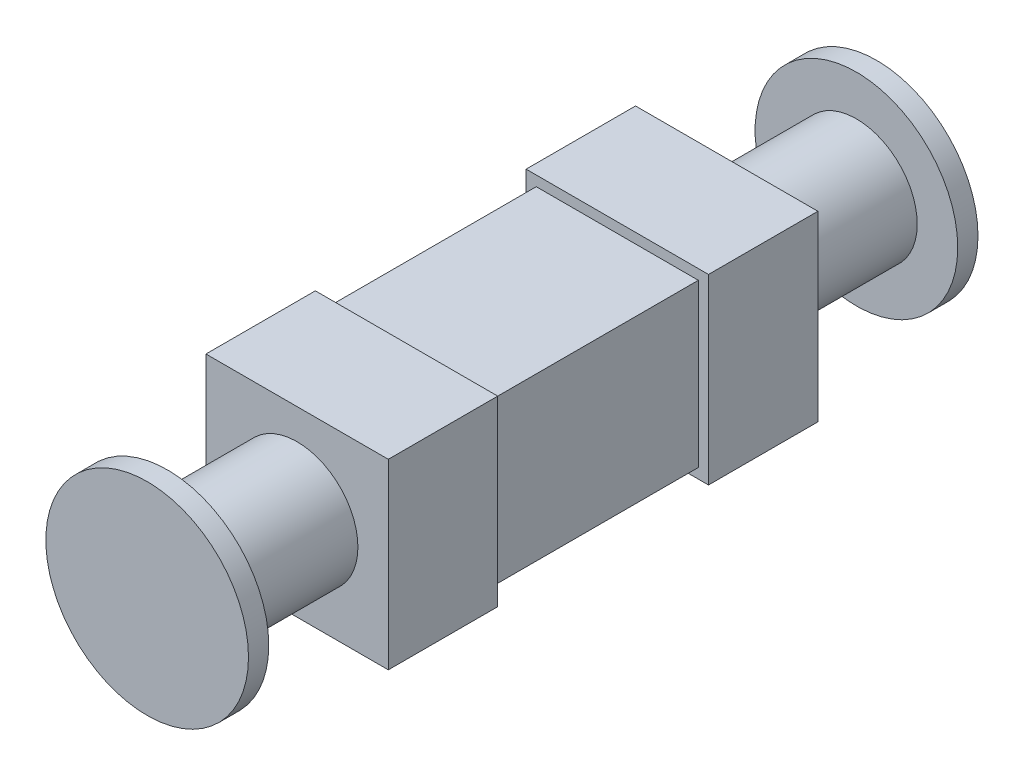
ISO-10303-21;
HEADER;
FILE_DESCRIPTION(('STEP AP214'),'2;1');
FILE_NAME('part.step','',(''),(''),'','','');
FILE_SCHEMA(('AUTOMOTIVE_DESIGN { 1 0 10303 214 1 1 1 1 }'));
ENDSEC;
DATA;
#1=APPLICATION_CONTEXT('core data for automotive mechanical design processes');
#2=APPLICATION_PROTOCOL_DEFINITION('international standard','automotive_design',2000,#1);
#3=PRODUCT_CONTEXT('',#1,'mechanical');
#4=PRODUCT('Part','Part','',(#3));
#5=PRODUCT_RELATED_PRODUCT_CATEGORY('part','',(#4));
#6=PRODUCT_DEFINITION_FORMATION('','',#4);
#7=PRODUCT_DEFINITION_CONTEXT('part definition',#1,'design');
#8=PRODUCT_DEFINITION('design','',#6,#7);
#9=PRODUCT_DEFINITION_SHAPE('','',#8);
#10=(LENGTH_UNIT() NAMED_UNIT(*) SI_UNIT(.MILLI.,.METRE.));
#11=(NAMED_UNIT(*) PLANE_ANGLE_UNIT() SI_UNIT($,.RADIAN.));
#12=(NAMED_UNIT(*) SI_UNIT($,.STERADIAN.) SOLID_ANGLE_UNIT());
#13=UNCERTAINTY_MEASURE_WITH_UNIT(LENGTH_MEASURE(1.E-05),#10,'distance_accuracy_value','');
#14=(GEOMETRIC_REPRESENTATION_CONTEXT(3) GLOBAL_UNCERTAINTY_ASSIGNED_CONTEXT((#13)) GLOBAL_UNIT_ASSIGNED_CONTEXT((#10,
#11,#12)) REPRESENTATION_CONTEXT('',''));
#15=CARTESIAN_POINT('',(0.,0.,0.));
#16=DIRECTION('',(0.,0.,1.));
#17=DIRECTION('',(1.,0.,0.));
#18=AXIS2_PLACEMENT_3D('',#15,#16,#17);
#19=CARTESIAN_POINT('',(-2.,-2.,-10.9568542494924));
#20=DIRECTION('',(-1.,0.,0.));
#21=DIRECTION('',(0.,0.,1.));
#22=AXIS2_PLACEMENT_3D('',#19,#20,#21);
#23=PLANE('',#22);
#24=DIRECTION('',(0.,0.,1.));
#25=VECTOR('',#24,1.);
#26=CARTESIAN_POINT('',(-2.,2.,-10.9568542494924));
#27=LINE('',#26,#25);
#28=CARTESIAN_POINT('',(-2.,2.,-2.6));
#29=VERTEX_POINT('',#28);
#30=CARTESIAN_POINT('',(-2.,2.,2.6));
#31=VERTEX_POINT('',#30);
#32=EDGE_CURVE('E215',#29,#31,#27,.T.);
#33=ORIENTED_EDGE('',*,*,#32,.F.);
#34=DIRECTION('',(0.,-1.,0.));
#35=VECTOR('',#34,1.);
#36=CARTESIAN_POINT('',(-2.,-2.,-2.6));
#37=LINE('',#36,#35);
#38=CARTESIAN_POINT('',(-2.,-2.,-2.6));
#39=VERTEX_POINT('',#38);
#40=EDGE_CURVE('E173',#29,#39,#37,.T.);
#41=ORIENTED_EDGE('',*,*,#40,.T.);
#42=DIRECTION('',(0.,0.,1.));
#43=VECTOR('',#42,1.);
#44=CARTESIAN_POINT('',(-2.,-2.,-10.9568542494924));
#45=LINE('',#44,#43);
#46=CARTESIAN_POINT('',(-2.,-2.,2.6));
#47=VERTEX_POINT('',#46);
#48=EDGE_CURVE('E59',#39,#47,#45,.T.);
#49=ORIENTED_EDGE('',*,*,#48,.T.);
#50=DIRECTION('',(0.,1.,0.));
#51=VECTOR('',#50,1.);
#52=CARTESIAN_POINT('',(-2.,-2.,2.6));
#53=LINE('',#52,#51);
#54=EDGE_CURVE('E213',#47,#31,#53,.T.);
#55=ORIENTED_EDGE('',*,*,#54,.T.);
#56=EDGE_LOOP('',(#33,#41,#49,#55));
#57=FACE_BOUND('',#56,.T.);
#58=ADVANCED_FACE('F37',(#57),#23,.T.);
#59=CARTESIAN_POINT('',(2.,2.,-10.9568542494924));
#60=DIRECTION('',(0.,1.,0.));
#61=DIRECTION('',(-1.,0.,0.));
#62=AXIS2_PLACEMENT_3D('',#59,#60,#61);
#63=PLANE('',#62);
#64=DIRECTION('',(0.,0.,1.));
#65=VECTOR('',#64,1.);
#66=CARTESIAN_POINT('',(2.,2.,-10.9568542494924));
#67=LINE('',#66,#65);
#68=CARTESIAN_POINT('',(2.,2.,-2.6));
#69=VERTEX_POINT('',#68);
#70=CARTESIAN_POINT('',(2.,2.,2.6));
#71=VERTEX_POINT('',#70);
#72=EDGE_CURVE('E218',#69,#71,#67,.T.);
#73=ORIENTED_EDGE('',*,*,#72,.F.);
#74=DIRECTION('',(-1.,0.,0.));
#75=VECTOR('',#74,1.);
#76=CARTESIAN_POINT('',(2.,2.,-2.6));
#77=LINE('',#76,#75);
#78=EDGE_CURVE('E170',#69,#29,#77,.T.);
#79=ORIENTED_EDGE('',*,*,#78,.T.);
#80=ORIENTED_EDGE('',*,*,#32,.T.);
#81=DIRECTION('',(1.,0.,0.));
#82=VECTOR('',#81,1.);
#83=CARTESIAN_POINT('',(2.,2.,2.6));
#84=LINE('',#83,#82);
#85=EDGE_CURVE('E210',#31,#71,#84,.T.);
#86=ORIENTED_EDGE('',*,*,#85,.T.);
#87=EDGE_LOOP('',(#73,#79,#80,#86));
#88=FACE_BOUND('',#87,.T.);
#89=ADVANCED_FACE('F259',(#88),#63,.T.);
#90=CARTESIAN_POINT('',(2.,-2.,-10.9568542494924));
#91=DIRECTION('',(1.,0.,0.));
#92=DIRECTION('',(0.,0.,-1.));
#93=AXIS2_PLACEMENT_3D('',#90,#91,#92);
#94=PLANE('',#93);
#95=DIRECTION('',(0.,0.,1.));
#96=VECTOR('',#95,1.);
#97=CARTESIAN_POINT('',(2.,-2.,-10.9568542494924));
#98=LINE('',#97,#96);
#99=CARTESIAN_POINT('',(2.,-2.,-2.6));
#100=VERTEX_POINT('',#99);
#101=CARTESIAN_POINT('',(2.,-2.,2.6));
#102=VERTEX_POINT('',#101);
#103=EDGE_CURVE('E220',#100,#102,#98,.T.);
#104=ORIENTED_EDGE('',*,*,#103,.F.);
#105=DIRECTION('',(0.,1.,0.));
#106=VECTOR('',#105,1.);
#107=CARTESIAN_POINT('',(2.,-2.,-2.6));
#108=LINE('',#107,#106);
#109=EDGE_CURVE('E52',#100,#69,#108,.T.);
#110=ORIENTED_EDGE('',*,*,#109,.T.);
#111=ORIENTED_EDGE('',*,*,#72,.T.);
#112=DIRECTION('',(0.,-1.,0.));
#113=VECTOR('',#112,1.);
#114=CARTESIAN_POINT('',(2.,-2.,2.6));
#115=LINE('',#114,#113);
#116=EDGE_CURVE('E202',#71,#102,#115,.T.);
#117=ORIENTED_EDGE('',*,*,#116,.T.);
#118=EDGE_LOOP('',(#104,#110,#111,#117));
#119=FACE_BOUND('',#118,.T.);
#120=ADVANCED_FACE('F256',(#119),#94,.T.);
#121=CARTESIAN_POINT('',(2.,-2.,-10.9568542494924));
#122=DIRECTION('',(0.,-1.,0.));
#123=DIRECTION('',(0.,0.,-1.));
#124=AXIS2_PLACEMENT_3D('',#121,#122,#123);
#125=PLANE('',#124);
#126=ORIENTED_EDGE('',*,*,#48,.F.);
#127=DIRECTION('',(1.,0.,0.));
#128=VECTOR('',#127,1.);
#129=CARTESIAN_POINT('',(2.,-2.,-2.6));
#130=LINE('',#129,#128);
#131=EDGE_CURVE('E11',#39,#100,#130,.T.);
#132=ORIENTED_EDGE('',*,*,#131,.T.);
#133=ORIENTED_EDGE('',*,*,#103,.T.);
#134=DIRECTION('',(-1.,0.,0.));
#135=VECTOR('',#134,1.);
#136=CARTESIAN_POINT('',(2.,-2.,2.6));
#137=LINE('',#136,#135);
#138=EDGE_CURVE('E45',#102,#47,#137,.T.);
#139=ORIENTED_EDGE('',*,*,#138,.T.);
#140=EDGE_LOOP('',(#126,#132,#133,#139));
#141=FACE_BOUND('',#140,.T.);
#142=ADVANCED_FACE('F248',(#141),#125,.T.);
#143=CARTESIAN_POINT('',(-2.25,-2.25,2.6));
#144=DIRECTION('',(-1.,0.,0.));
#145=DIRECTION('',(0.,0.,1.));
#146=AXIS2_PLACEMENT_3D('',#143,#144,#145);
#147=PLANE('',#146);
#148=DIRECTION('',(0.,-1.,0.));
#149=VECTOR('',#148,1.);
#150=CARTESIAN_POINT('',(-2.25,-2.25,5.3));
#151=LINE('',#150,#149);
#152=CARTESIAN_POINT('',(-2.25,2.25,5.3));
#153=VERTEX_POINT('',#152);
#154=CARTESIAN_POINT('',(-2.25,-2.25,5.3));
#155=VERTEX_POINT('',#154);
#156=EDGE_CURVE('E175',#153,#155,#151,.T.);
#157=ORIENTED_EDGE('',*,*,#156,.F.);
#158=DIRECTION('',(0.,0.,1.));
#159=VECTOR('',#158,1.);
#160=CARTESIAN_POINT('',(-2.25,2.25,2.6));
#161=LINE('',#160,#159);
#162=CARTESIAN_POINT('',(-2.25,2.25,2.6));
#163=VERTEX_POINT('',#162);
#164=EDGE_CURVE('E200',#163,#153,#161,.T.);
#165=ORIENTED_EDGE('',*,*,#164,.F.);
#166=DIRECTION('',(0.,-1.,0.));
#167=VECTOR('',#166,1.);
#168=CARTESIAN_POINT('',(-2.25,-2.25,2.6));
#169=LINE('',#168,#167);
#170=CARTESIAN_POINT('',(-2.25,-2.25,2.6));
#171=VERTEX_POINT('',#170);
#172=EDGE_CURVE('E176',#163,#171,#169,.T.);
#173=ORIENTED_EDGE('',*,*,#172,.T.);
#174=DIRECTION('',(0.,0.,1.));
#175=VECTOR('',#174,1.);
#176=CARTESIAN_POINT('',(-2.25,-2.25,2.6));
#177=LINE('',#176,#175);
#178=EDGE_CURVE('E189',#171,#155,#177,.T.);
#179=ORIENTED_EDGE('',*,*,#178,.T.);
#180=EDGE_LOOP('',(#157,#165,#173,#179));
#181=FACE_BOUND('',#180,.T.);
#182=ADVANCED_FACE('F329',(#181),#147,.T.);
#183=CARTESIAN_POINT('',(2.25,2.25,2.6));
#184=DIRECTION('',(0.,1.,0.));
#185=DIRECTION('',(-1.,0.,0.));
#186=AXIS2_PLACEMENT_3D('',#183,#184,#185);
#187=PLANE('',#186);
#188=DIRECTION('',(-1.,0.,0.));
#189=VECTOR('',#188,1.);
#190=CARTESIAN_POINT('',(2.25,2.25,5.3));
#191=LINE('',#190,#189);
#192=CARTESIAN_POINT('',(2.25,2.25,5.3));
#193=VERTEX_POINT('',#192);
#194=EDGE_CURVE('E180',#193,#153,#191,.T.);
#195=ORIENTED_EDGE('',*,*,#194,.F.);
#196=DIRECTION('',(0.,0.,1.));
#197=VECTOR('',#196,1.);
#198=CARTESIAN_POINT('',(2.25,2.25,2.6));
#199=LINE('',#198,#197);
#200=CARTESIAN_POINT('',(2.25,2.25,2.6));
#201=VERTEX_POINT('',#200);
#202=EDGE_CURVE('E203',#201,#193,#199,.T.);
#203=ORIENTED_EDGE('',*,*,#202,.F.);
#204=DIRECTION('',(-1.,0.,0.));
#205=VECTOR('',#204,1.);
#206=CARTESIAN_POINT('',(2.25,2.25,2.6));
#207=LINE('',#206,#205);
#208=EDGE_CURVE('E186',#201,#163,#207,.T.);
#209=ORIENTED_EDGE('',*,*,#208,.T.);
#210=ORIENTED_EDGE('',*,*,#164,.T.);
#211=EDGE_LOOP('',(#195,#203,#209,#210));
#212=FACE_BOUND('',#211,.T.);
#213=ADVANCED_FACE('F339',(#212),#187,.T.);
#214=CARTESIAN_POINT('',(2.25,-2.25,2.6));
#215=DIRECTION('',(1.,0.,0.));
#216=DIRECTION('',(0.,0.,-1.));
#217=AXIS2_PLACEMENT_3D('',#214,#215,#216);
#218=PLANE('',#217);
#219=DIRECTION('',(0.,1.,0.));
#220=VECTOR('',#219,1.);
#221=CARTESIAN_POINT('',(2.25,-2.25,5.3));
#222=LINE('',#221,#220);
#223=CARTESIAN_POINT('',(2.25,-2.25,5.3));
#224=VERTEX_POINT('',#223);
#225=EDGE_CURVE('E195',#224,#193,#222,.T.);
#226=ORIENTED_EDGE('',*,*,#225,.F.);
#227=DIRECTION('',(0.,0.,1.));
#228=VECTOR('',#227,1.);
#229=CARTESIAN_POINT('',(2.25,-2.25,2.6));
#230=LINE('',#229,#228);
#231=CARTESIAN_POINT('',(2.25,-2.25,2.6));
#232=VERTEX_POINT('',#231);
#233=EDGE_CURVE('E205',#232,#224,#230,.T.);
#234=ORIENTED_EDGE('',*,*,#233,.F.);
#235=DIRECTION('',(0.,1.,0.));
#236=VECTOR('',#235,1.);
#237=CARTESIAN_POINT('',(2.25,-2.25,2.6));
#238=LINE('',#237,#236);
#239=EDGE_CURVE('E183',#232,#201,#238,.T.);
#240=ORIENTED_EDGE('',*,*,#239,.T.);
#241=ORIENTED_EDGE('',*,*,#202,.T.);
#242=EDGE_LOOP('',(#226,#234,#240,#241));
#243=FACE_BOUND('',#242,.T.);
#244=ADVANCED_FACE('F337',(#243),#218,.T.);
#245=CARTESIAN_POINT('',(2.25,-2.25,2.6));
#246=DIRECTION('',(0.,-1.,0.));
#247=DIRECTION('',(1.,0.,0.));
#248=AXIS2_PLACEMENT_3D('',#245,#246,#247);
#249=PLANE('',#248);
#250=DIRECTION('',(1.,0.,0.));
#251=VECTOR('',#250,1.);
#252=CARTESIAN_POINT('',(2.25,-2.25,5.3));
#253=LINE('',#252,#251);
#254=EDGE_CURVE('E192',#155,#224,#253,.T.);
#255=ORIENTED_EDGE('',*,*,#254,.F.);
#256=ORIENTED_EDGE('',*,*,#178,.F.);
#257=DIRECTION('',(1.,0.,0.));
#258=VECTOR('',#257,1.);
#259=CARTESIAN_POINT('',(2.25,-2.25,2.6));
#260=LINE('',#259,#258);
#261=EDGE_CURVE('E179',#171,#232,#260,.T.);
#262=ORIENTED_EDGE('',*,*,#261,.T.);
#263=ORIENTED_EDGE('',*,*,#233,.T.);
#264=EDGE_LOOP('',(#255,#256,#262,#263));
#265=FACE_BOUND('',#264,.T.);
#266=ADVANCED_FACE('F333',(#265),#249,.T.);
#267=CARTESIAN_POINT('',(0.,0.,2.6));
#268=DIRECTION('',(0.,0.,1.));
#269=DIRECTION('',(1.,0.,0.));
#270=AXIS2_PLACEMENT_3D('',#267,#268,#269);
#271=PLANE('',#270);
#272=ORIENTED_EDGE('',*,*,#54,.F.);
#273=ORIENTED_EDGE('',*,*,#138,.F.);
#274=ORIENTED_EDGE('',*,*,#116,.F.);
#275=ORIENTED_EDGE('',*,*,#85,.F.);
#276=EDGE_LOOP('',(#272,#273,#274,#275));
#277=FACE_BOUND('',#276,.T.);
#278=ORIENTED_EDGE('',*,*,#172,.F.);
#279=ORIENTED_EDGE('',*,*,#208,.F.);
#280=ORIENTED_EDGE('',*,*,#239,.F.);
#281=ORIENTED_EDGE('',*,*,#261,.F.);
#282=EDGE_LOOP('',(#278,#279,#280,#281));
#283=FACE_BOUND('',#282,.T.);
#284=ADVANCED_FACE('F252',(#277,#283),#271,.F.);
#285=CARTESIAN_POINT('',(0.,0.,9.));
#286=DIRECTION('',(0.,0.,-1.));
#287=DIRECTION('',(-1.,0.,0.));
#288=AXIS2_PLACEMENT_3D('',#285,#286,#287);
#289=PLANE('',#288);
#290=CARTESIAN_POINT('',(0.,0.,9.));
#291=DIRECTION('',(0.,0.,1.));
#292=DIRECTION('',(1.,0.,0.));
#293=AXIS2_PLACEMENT_3D('',#290,#291,#292);
#294=CIRCLE('',#293,2.5);
#295=CARTESIAN_POINT('',(2.5,0.,9.));
#296=VERTEX_POINT('',#295);
#297=EDGE_CURVE('E243',#296,#296,#294,.T.);
#298=ORIENTED_EDGE('',*,*,#297,.T.);
#299=EDGE_LOOP('',(#298));
#300=FACE_BOUND('',#299,.T.);
#301=ADVANCED_FACE('F39',(#300),#289,.F.);
#302=CARTESIAN_POINT('',(0.,0.,9.));
#303=DIRECTION('',(0.,0.,1.));
#304=DIRECTION('',(1.,0.,0.));
#305=AXIS2_PLACEMENT_3D('',#302,#303,#304);
#306=CYLINDRICAL_SURFACE('',#305,2.5);
#307=ORIENTED_EDGE('',*,*,#297,.F.);
#308=EDGE_LOOP('',(#307));
#309=FACE_BOUND('',#308,.T.);
#310=CARTESIAN_POINT('',(0.,0.,8.5));
#311=DIRECTION('',(0.,0.,1.));
#312=DIRECTION('',(1.,0.,0.));
#313=AXIS2_PLACEMENT_3D('',#310,#311,#312);
#314=CIRCLE('',#313,2.5);
#315=CARTESIAN_POINT('',(2.5,0.,8.5));
#316=VERTEX_POINT('',#315);
#317=EDGE_CURVE('E240',#316,#316,#314,.T.);
#318=ORIENTED_EDGE('',*,*,#317,.T.);
#319=EDGE_LOOP('',(#318));
#320=FACE_BOUND('',#319,.T.);
#321=ADVANCED_FACE('F309',(#309,#320),#306,.T.);
#322=CARTESIAN_POINT('',(0.,2.5,8.5));
#323=DIRECTION('',(0.,0.,1.));
#324=DIRECTION('',(1.,0.,0.));
#325=AXIS2_PLACEMENT_3D('',#322,#323,#324);
#326=PLANE('',#325);
#327=ORIENTED_EDGE('',*,*,#317,.F.);
#328=EDGE_LOOP('',(#327));
#329=FACE_BOUND('',#328,.T.);
#330=CARTESIAN_POINT('',(0.,0.,8.5));
#331=DIRECTION('',(0.,0.,1.));
#332=DIRECTION('',(1.,0.,0.));
#333=AXIS2_PLACEMENT_3D('',#330,#331,#332);
#334=CIRCLE('',#333,1.5);
#335=CARTESIAN_POINT('',(1.5,0.,8.5));
#336=VERTEX_POINT('',#335);
#337=EDGE_CURVE('E237',#336,#336,#334,.T.);
#338=ORIENTED_EDGE('',*,*,#337,.T.);
#339=EDGE_LOOP('',(#338));
#340=FACE_BOUND('',#339,.T.);
#341=ADVANCED_FACE('F306',(#329,#340),#326,.F.);
#342=CARTESIAN_POINT('',(0.,0.,9.));
#343=DIRECTION('',(0.,0.,1.));
#344=DIRECTION('',(1.,0.,0.));
#345=AXIS2_PLACEMENT_3D('',#342,#343,#344);
#346=CYLINDRICAL_SURFACE('',#345,1.5);
#347=ORIENTED_EDGE('',*,*,#337,.F.);
#348=EDGE_LOOP('',(#347));
#349=FACE_BOUND('',#348,.T.);
#350=CARTESIAN_POINT('',(0.,0.,5.3));
#351=DIRECTION('',(0.,0.,1.));
#352=DIRECTION('',(1.,0.,0.));
#353=AXIS2_PLACEMENT_3D('',#350,#351,#352);
#354=CIRCLE('',#353,1.5);
#355=CARTESIAN_POINT('',(1.5,0.,5.3));
#356=VERTEX_POINT('',#355);
#357=EDGE_CURVE('E234',#356,#356,#354,.T.);
#358=ORIENTED_EDGE('',*,*,#357,.T.);
#359=EDGE_LOOP('',(#358));
#360=FACE_BOUND('',#359,.T.);
#361=ADVANCED_FACE('F302',(#349,#360),#346,.T.);
#362=CARTESIAN_POINT('',(0.,1.5,5.3));
#363=DIRECTION('',(0.,0.,-1.));
#364=DIRECTION('',(-1.,0.,0.));
#365=AXIS2_PLACEMENT_3D('',#362,#363,#364);
#366=PLANE('',#365);
#367=ORIENTED_EDGE('',*,*,#357,.F.);
#368=EDGE_LOOP('',(#367));
#369=FACE_BOUND('',#368,.T.);
#370=ORIENTED_EDGE('',*,*,#156,.T.);
#371=ORIENTED_EDGE('',*,*,#254,.T.);
#372=ORIENTED_EDGE('',*,*,#225,.T.);
#373=ORIENTED_EDGE('',*,*,#194,.T.);
#374=EDGE_LOOP('',(#370,#371,#372,#373));
#375=FACE_BOUND('',#374,.T.);
#376=ADVANCED_FACE('F299',(#369,#375),#366,.F.);
#377=CARTESIAN_POINT('',(-2.25,-2.25,-2.6));
#378=DIRECTION('',(1.,0.,0.));
#379=DIRECTION('',(0.,0.,-1.));
#380=AXIS2_PLACEMENT_3D('',#377,#378,#379);
#381=PLANE('',#380);
#382=DIRECTION('',(0.,-1.,0.));
#383=VECTOR('',#382,1.);
#384=CARTESIAN_POINT('',(-2.25,-2.25,-5.3));
#385=LINE('',#384,#383);
#386=CARTESIAN_POINT('',(-2.25,2.25,-5.3));
#387=VERTEX_POINT('',#386);
#388=CARTESIAN_POINT('',(-2.25,-2.25,-5.3));
#389=VERTEX_POINT('',#388);
#390=EDGE_CURVE('E160',#387,#389,#385,.T.);
#391=ORIENTED_EDGE('',*,*,#390,.T.);
#392=DIRECTION('',(0.,0.,-1.));
#393=VECTOR('',#392,1.);
#394=CARTESIAN_POINT('',(-2.25,-2.25,-2.6));
#395=LINE('',#394,#393);
#396=CARTESIAN_POINT('',(-2.25,-2.25,-2.6));
#397=VERTEX_POINT('',#396);
#398=EDGE_CURVE('E152',#397,#389,#395,.T.);
#399=ORIENTED_EDGE('',*,*,#398,.F.);
#400=DIRECTION('',(0.,-1.,0.));
#401=VECTOR('',#400,1.);
#402=CARTESIAN_POINT('',(-2.25,-2.25,-2.6));
#403=LINE('',#402,#401);
#404=CARTESIAN_POINT('',(-2.25,2.25,-2.6));
#405=VERTEX_POINT('',#404);
#406=EDGE_CURVE('E131',#405,#397,#403,.T.);
#407=ORIENTED_EDGE('',*,*,#406,.F.);
#408=DIRECTION('',(0.,0.,-1.));
#409=VECTOR('',#408,1.);
#410=CARTESIAN_POINT('',(-2.25,2.25,-2.6));
#411=LINE('',#410,#409);
#412=EDGE_CURVE('E140',#405,#387,#411,.T.);
#413=ORIENTED_EDGE('',*,*,#412,.T.);
#414=EDGE_LOOP('',(#391,#399,#407,#413));
#415=FACE_BOUND('',#414,.T.);
#416=ADVANCED_FACE('F150',(#415),#381,.F.);
#417=CARTESIAN_POINT('',(2.25,-2.25,-2.6));
#418=DIRECTION('',(0.,1.,0.));
#419=DIRECTION('',(-1.,0.,0.));
#420=AXIS2_PLACEMENT_3D('',#417,#418,#419);
#421=PLANE('',#420);
#422=DIRECTION('',(1.,0.,0.));
#423=VECTOR('',#422,1.);
#424=CARTESIAN_POINT('',(2.25,-2.25,-5.3));
#425=LINE('',#424,#423);
#426=CARTESIAN_POINT('',(2.25,-2.25,-5.3));
#427=VERTEX_POINT('',#426);
#428=EDGE_CURVE('E153',#389,#427,#425,.T.);
#429=ORIENTED_EDGE('',*,*,#428,.T.);
#430=DIRECTION('',(0.,0.,-1.));
#431=VECTOR('',#430,1.);
#432=CARTESIAN_POINT('',(2.25,-2.25,-2.6));
#433=LINE('',#432,#431);
#434=CARTESIAN_POINT('',(2.25,-2.25,-2.6));
#435=VERTEX_POINT('',#434);
#436=EDGE_CURVE('E165',#435,#427,#433,.T.);
#437=ORIENTED_EDGE('',*,*,#436,.F.);
#438=DIRECTION('',(1.,0.,0.));
#439=VECTOR('',#438,1.);
#440=CARTESIAN_POINT('',(2.25,-2.25,-2.6));
#441=LINE('',#440,#439);
#442=EDGE_CURVE('E148',#397,#435,#441,.T.);
#443=ORIENTED_EDGE('',*,*,#442,.F.);
#444=ORIENTED_EDGE('',*,*,#398,.T.);
#445=EDGE_LOOP('',(#429,#437,#443,#444));
#446=FACE_BOUND('',#445,.T.);
#447=ADVANCED_FACE('F369',(#446),#421,.F.);
#448=CARTESIAN_POINT('',(2.25,-2.25,-2.6));
#449=DIRECTION('',(-1.,0.,0.));
#450=DIRECTION('',(0.,0.,1.));
#451=AXIS2_PLACEMENT_3D('',#448,#449,#450);
#452=PLANE('',#451);
#453=DIRECTION('',(0.,1.,0.));
#454=VECTOR('',#453,1.);
#455=CARTESIAN_POINT('',(2.25,-2.25,-5.3));
#456=LINE('',#455,#454);
#457=CARTESIAN_POINT('',(2.25,2.25,-5.3));
#458=VERTEX_POINT('',#457);
#459=EDGE_CURVE('E155',#427,#458,#456,.T.);
#460=ORIENTED_EDGE('',*,*,#459,.T.);
#461=DIRECTION('',(0.,0.,-1.));
#462=VECTOR('',#461,1.);
#463=CARTESIAN_POINT('',(2.25,2.25,-2.6));
#464=LINE('',#463,#462);
#465=CARTESIAN_POINT('',(2.25,2.25,-2.6));
#466=VERTEX_POINT('',#465);
#467=EDGE_CURVE('E147',#466,#458,#464,.T.);
#468=ORIENTED_EDGE('',*,*,#467,.F.);
#469=DIRECTION('',(0.,1.,0.));
#470=VECTOR('',#469,1.);
#471=CARTESIAN_POINT('',(2.25,-2.25,-2.6));
#472=LINE('',#471,#470);
#473=EDGE_CURVE('E134',#435,#466,#472,.T.);
#474=ORIENTED_EDGE('',*,*,#473,.F.);
#475=ORIENTED_EDGE('',*,*,#436,.T.);
#476=EDGE_LOOP('',(#460,#468,#474,#475));
#477=FACE_BOUND('',#476,.T.);
#478=ADVANCED_FACE('F272',(#477),#452,.F.);
#479=CARTESIAN_POINT('',(2.25,2.25,-2.6));
#480=DIRECTION('',(0.,-1.,0.));
#481=DIRECTION('',(1.,0.,0.));
#482=AXIS2_PLACEMENT_3D('',#479,#480,#481);
#483=PLANE('',#482);
#484=DIRECTION('',(-1.,0.,0.));
#485=VECTOR('',#484,1.);
#486=CARTESIAN_POINT('',(2.25,2.25,-5.3));
#487=LINE('',#486,#485);
#488=EDGE_CURVE('E143',#458,#387,#487,.T.);
#489=ORIENTED_EDGE('',*,*,#488,.T.);
#490=ORIENTED_EDGE('',*,*,#412,.F.);
#491=DIRECTION('',(-1.,0.,0.));
#492=VECTOR('',#491,1.);
#493=CARTESIAN_POINT('',(2.25,2.25,-2.6));
#494=LINE('',#493,#492);
#495=EDGE_CURVE('E127',#466,#405,#494,.T.);
#496=ORIENTED_EDGE('',*,*,#495,.F.);
#497=ORIENTED_EDGE('',*,*,#467,.T.);
#498=EDGE_LOOP('',(#489,#490,#496,#497));
#499=FACE_BOUND('',#498,.T.);
#500=ADVANCED_FACE('F141',(#499),#483,.F.);
#501=CARTESIAN_POINT('',(0.,0.,-2.6));
#502=DIRECTION('',(0.,0.,-1.));
#503=DIRECTION('',(1.,0.,0.));
#504=AXIS2_PLACEMENT_3D('',#501,#502,#503);
#505=PLANE('',#504);
#506=ORIENTED_EDGE('',*,*,#40,.F.);
#507=ORIENTED_EDGE('',*,*,#78,.F.);
#508=ORIENTED_EDGE('',*,*,#109,.F.);
#509=ORIENTED_EDGE('',*,*,#131,.F.);
#510=EDGE_LOOP('',(#506,#507,#508,#509));
#511=FACE_BOUND('',#510,.T.);
#512=ORIENTED_EDGE('',*,*,#406,.T.);
#513=ORIENTED_EDGE('',*,*,#442,.T.);
#514=ORIENTED_EDGE('',*,*,#473,.T.);
#515=ORIENTED_EDGE('',*,*,#495,.T.);
#516=EDGE_LOOP('',(#512,#513,#514,#515));
#517=FACE_BOUND('',#516,.T.);
#518=ADVANCED_FACE('F129',(#511,#517),#505,.F.);
#519=CARTESIAN_POINT('',(0.,0.,-9.));
#520=DIRECTION('',(0.,0.,1.));
#521=DIRECTION('',(1.,0.,0.));
#522=AXIS2_PLACEMENT_3D('',#519,#520,#521);
#523=PLANE('',#522);
#524=CARTESIAN_POINT('',(0.,0.,-9.));
#525=DIRECTION('',(0.,0.,1.));
#526=DIRECTION('',(1.,0.,0.));
#527=AXIS2_PLACEMENT_3D('',#524,#525,#526);
#528=CIRCLE('',#527,2.5);
#529=CARTESIAN_POINT('',(2.5,0.,-9.));
#530=VERTEX_POINT('',#529);
#531=EDGE_CURVE('E217',#530,#530,#528,.T.);
#532=ORIENTED_EDGE('',*,*,#531,.F.);
#533=EDGE_LOOP('',(#532));
#534=FACE_BOUND('',#533,.T.);
#535=ADVANCED_FACE('F262',(#534),#523,.F.);
#536=CARTESIAN_POINT('',(0.,0.,9.));
#537=DIRECTION('',(0.,0.,1.));
#538=DIRECTION('',(1.,0.,0.));
#539=AXIS2_PLACEMENT_3D('',#536,#537,#538);
#540=CYLINDRICAL_SURFACE('',#539,2.5);
#541=CARTESIAN_POINT('',(0.,0.,-8.5));
#542=DIRECTION('',(0.,0.,1.));
#543=DIRECTION('',(1.,0.,0.));
#544=AXIS2_PLACEMENT_3D('',#541,#542,#543);
#545=CIRCLE('',#544,2.5);
#546=CARTESIAN_POINT('',(2.5,0.,-8.5));
#547=VERTEX_POINT('',#546);
#548=EDGE_CURVE('E225',#547,#547,#545,.T.);
#549=ORIENTED_EDGE('',*,*,#548,.F.);
#550=EDGE_LOOP('',(#549));
#551=FACE_BOUND('',#550,.T.);
#552=ORIENTED_EDGE('',*,*,#531,.T.);
#553=EDGE_LOOP('',(#552));
#554=FACE_BOUND('',#553,.T.);
#555=ADVANCED_FACE('F269',(#551,#554),#540,.T.);
#556=CARTESIAN_POINT('',(0.,1.5,-8.5));
#557=DIRECTION('',(0.,0.,-1.));
#558=DIRECTION('',(-1.,0.,0.));
#559=AXIS2_PLACEMENT_3D('',#556,#557,#558);
#560=PLANE('',#559);
#561=CARTESIAN_POINT('',(0.,0.,-8.5));
#562=DIRECTION('',(0.,0.,1.));
#563=DIRECTION('',(1.,0.,0.));
#564=AXIS2_PLACEMENT_3D('',#561,#562,#563);
#565=CIRCLE('',#564,1.5);
#566=CARTESIAN_POINT('',(1.5,0.,-8.5));
#567=VERTEX_POINT('',#566);
#568=EDGE_CURVE('E228',#567,#567,#565,.T.);
#569=ORIENTED_EDGE('',*,*,#568,.F.);
#570=EDGE_LOOP('',(#569));
#571=FACE_BOUND('',#570,.T.);
#572=ORIENTED_EDGE('',*,*,#548,.T.);
#573=EDGE_LOOP('',(#572));
#574=FACE_BOUND('',#573,.T.);
#575=ADVANCED_FACE('F287',(#571,#574),#560,.F.);
#576=CARTESIAN_POINT('',(0.,0.,9.));
#577=DIRECTION('',(0.,0.,1.));
#578=DIRECTION('',(1.,0.,0.));
#579=AXIS2_PLACEMENT_3D('',#576,#577,#578);
#580=CYLINDRICAL_SURFACE('',#579,1.5);
#581=CARTESIAN_POINT('',(0.,0.,-5.3));
#582=DIRECTION('',(0.,0.,1.));
#583=DIRECTION('',(1.,0.,0.));
#584=AXIS2_PLACEMENT_3D('',#581,#582,#583);
#585=CIRCLE('',#584,1.5);
#586=CARTESIAN_POINT('',(1.5,0.,-5.3));
#587=VERTEX_POINT('',#586);
#588=EDGE_CURVE('E231',#587,#587,#585,.T.);
#589=ORIENTED_EDGE('',*,*,#588,.F.);
#590=EDGE_LOOP('',(#589));
#591=FACE_BOUND('',#590,.T.);
#592=ORIENTED_EDGE('',*,*,#568,.T.);
#593=EDGE_LOOP('',(#592));
#594=FACE_BOUND('',#593,.T.);
#595=ADVANCED_FACE('F291',(#591,#594),#580,.T.);
#596=CARTESIAN_POINT('',(0.,2.,-5.3));
#597=DIRECTION('',(0.,0.,1.));
#598=DIRECTION('',(1.,0.,0.));
#599=AXIS2_PLACEMENT_3D('',#596,#597,#598);
#600=PLANE('',#599);
#601=ORIENTED_EDGE('',*,*,#588,.T.);
#602=EDGE_LOOP('',(#601));
#603=FACE_BOUND('',#602,.T.);
#604=ORIENTED_EDGE('',*,*,#390,.F.);
#605=ORIENTED_EDGE('',*,*,#488,.F.);
#606=ORIENTED_EDGE('',*,*,#459,.F.);
#607=ORIENTED_EDGE('',*,*,#428,.F.);
#608=EDGE_LOOP('',(#604,#605,#606,#607));
#609=FACE_BOUND('',#608,.T.);
#610=ADVANCED_FACE('F295',(#603,#609),#600,.F.);
#611=CLOSED_SHELL('',(#58,#89,#120,#142,#182,#213,#244,#266,#284,#301,#321,#341,#361,#376,#416,
#447,#478,#500,#518,#535,#555,#575,#595,#610));
#612=MANIFOLD_SOLID_BREP('B2',#611);
#613=ADVANCED_BREP_SHAPE_REPRESENTATION('',(#18,#612),#14);
#614=SHAPE_DEFINITION_REPRESENTATION(#9,#613);
ENDSEC;
END-ISO-10303-21;
